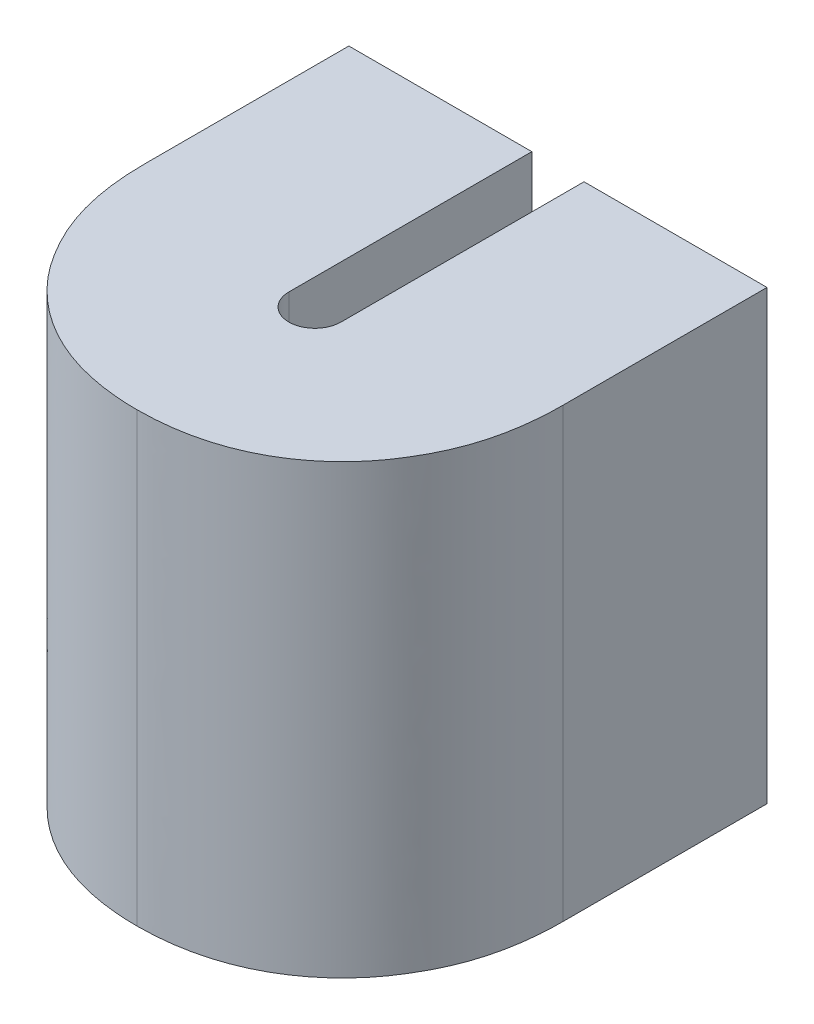
ISO-10303-21;
HEADER;
FILE_DESCRIPTION(('STEP AP214'),'2;1');
FILE_NAME('part.step','',(''),(''),'','','');
FILE_SCHEMA(('AUTOMOTIVE_DESIGN { 1 0 10303 214 1 1 1 1 }'));
ENDSEC;
DATA;
#1=APPLICATION_CONTEXT('core data for automotive mechanical design processes');
#2=APPLICATION_PROTOCOL_DEFINITION('international standard','automotive_design',2000,#1);
#3=PRODUCT_CONTEXT('',#1,'mechanical');
#4=PRODUCT('Part','Part','',(#3));
#5=PRODUCT_RELATED_PRODUCT_CATEGORY('part','',(#4));
#6=PRODUCT_DEFINITION_FORMATION('','',#4);
#7=PRODUCT_DEFINITION_CONTEXT('part definition',#1,'design');
#8=PRODUCT_DEFINITION('design','',#6,#7);
#9=PRODUCT_DEFINITION_SHAPE('','',#8);
#10=(LENGTH_UNIT() NAMED_UNIT(*) SI_UNIT(.MILLI.,.METRE.));
#11=(NAMED_UNIT(*) PLANE_ANGLE_UNIT() SI_UNIT($,.RADIAN.));
#12=(NAMED_UNIT(*) SI_UNIT($,.STERADIAN.) SOLID_ANGLE_UNIT());
#13=UNCERTAINTY_MEASURE_WITH_UNIT(LENGTH_MEASURE(1.E-05),#10,'distance_accuracy_value','');
#14=(GEOMETRIC_REPRESENTATION_CONTEXT(3) GLOBAL_UNCERTAINTY_ASSIGNED_CONTEXT((#13)) GLOBAL_UNIT_ASSIGNED_CONTEXT((#10,
#11,#12)) REPRESENTATION_CONTEXT('',''));
#15=CARTESIAN_POINT('',(0.,0.,0.));
#16=DIRECTION('',(0.,0.,1.));
#17=DIRECTION('',(1.,0.,0.));
#18=AXIS2_PLACEMENT_3D('',#15,#16,#17);
#19=CARTESIAN_POINT('',(-701.33693305751,1500.,-727.733409360212));
#20=CARTESIAN_POINT('',(-701.33693305751,1500.,-516.521967782166));
#21=CARTESIAN_POINT('',(-626.802318267884,1500.,-362.488301594403));
#22=CARTESIAN_POINT('',(-504.735344157562,1500.,-189.729761618299));
#23=CARTESIAN_POINT('',(-300.828052657585,1500.,1.50207767655617E-11));
#24=CARTESIAN_POINT('',(7.20848692998497E-12,1500.,0.));
#25=B_SPLINE_CURVE_WITH_KNOTS('',3,(#19,#20,#21,#22,#23,#24),.UNSPECIFIED.,.F.,.F.,(4,1,1,4),
(0.,0.501134505368616,0.601134505368616,1.),.UNSPECIFIED.);
#26=DIRECTION('',(0.,-1.,0.));
#27=VECTOR('',#26,1.);
#28=SURFACE_OF_LINEAR_EXTRUSION('',#25,#27);
#29=CARTESIAN_POINT('',(-701.33693305751,0.,-727.733409360212));
#30=CARTESIAN_POINT('',(-701.33693305751,0.,-516.521967782166));
#31=CARTESIAN_POINT('',(-626.802318267884,0.,-362.488301594403));
#32=CARTESIAN_POINT('',(-504.735344157562,0.,-189.729761618299));
#33=CARTESIAN_POINT('',(-300.828052657585,0.,1.50207767655617E-11));
#34=CARTESIAN_POINT('',(7.20848692998497E-12,0.,0.));
#35=B_SPLINE_CURVE_WITH_KNOTS('',3,(#29,#30,#31,#32,#33,#34),.UNSPECIFIED.,.F.,.F.,(4,1,1,4),
(0.,0.501134505368616,0.601134505368616,1.),.UNSPECIFIED.);
#36=CARTESIAN_POINT('',(-701.33693305751,0.,-727.733409360212));
#37=VERTEX_POINT('',#36);
#38=CARTESIAN_POINT('',(-7.20848692998497E-12,0.,0.));
#39=VERTEX_POINT('',#38);
#40=EDGE_CURVE('E140',#37,#39,#35,.T.);
#41=ORIENTED_EDGE('',*,*,#40,.T.);
#42=DIRECTION('',(0.,-1.,0.));
#43=VECTOR('',#42,1.);
#44=CARTESIAN_POINT('',(-7.20848692998497E-12,1500.,0.));
#45=LINE('',#44,#43);
#46=CARTESIAN_POINT('',(-7.20848692998497E-12,1500.,0.));
#47=VERTEX_POINT('',#46);
#48=EDGE_CURVE('E11',#47,#39,#45,.T.);
#49=ORIENTED_EDGE('',*,*,#48,.F.);
#50=CARTESIAN_POINT('',(-701.33693305751,1500.,-727.733409360212));
#51=VERTEX_POINT('',#50);
#52=EDGE_CURVE('E166',#51,#47,#25,.T.);
#53=ORIENTED_EDGE('',*,*,#52,.F.);
#54=DIRECTION('',(0.,-1.,0.));
#55=VECTOR('',#54,1.);
#56=CARTESIAN_POINT('',(-701.33693305751,1500.,-727.733409360212));
#57=LINE('',#56,#55);
#58=EDGE_CURVE('E136',#51,#37,#57,.T.);
#59=ORIENTED_EDGE('',*,*,#58,.T.);
#60=EDGE_LOOP('',(#41,#49,#53,#59));
#61=FACE_BOUND('',#60,.T.);
#62=ADVANCED_FACE('F37',(#61),#28,.F.);
#63=CARTESIAN_POINT('',(-7.20848692998497E-12,1500.,0.));
#64=CARTESIAN_POINT('',(300.828052657585,1500.,1.50207767655617E-11));
#65=CARTESIAN_POINT('',(504.735344157562,1500.,-189.729761618299));
#66=CARTESIAN_POINT('',(626.802318267884,1500.,-362.488301594403));
#67=CARTESIAN_POINT('',(701.33693305751,1500.,-516.521967782166));
#68=CARTESIAN_POINT('',(701.33693305751,1500.,-727.733409360212));
#69=B_SPLINE_CURVE_WITH_KNOTS('',3,(#63,#64,#65,#66,#67,#68),.UNSPECIFIED.,.F.,.F.,(4,1,1,4),
(0.,0.398865494631384,0.498865494631384,1.),.UNSPECIFIED.);
#70=DIRECTION('',(0.,-1.,0.));
#71=VECTOR('',#70,1.);
#72=SURFACE_OF_LINEAR_EXTRUSION('',#69,#71);
#73=CARTESIAN_POINT('',(-7.20848692998497E-12,0.,0.));
#74=CARTESIAN_POINT('',(300.828052657585,0.,1.50207767655617E-11));
#75=CARTESIAN_POINT('',(504.735344157562,0.,-189.729761618299));
#76=CARTESIAN_POINT('',(626.802318267884,0.,-362.488301594403));
#77=CARTESIAN_POINT('',(701.33693305751,0.,-516.521967782166));
#78=CARTESIAN_POINT('',(701.33693305751,0.,-727.733409360212));
#79=B_SPLINE_CURVE_WITH_KNOTS('',3,(#73,#74,#75,#76,#77,#78),.UNSPECIFIED.,.F.,.F.,(4,1,1,4),
(0.,0.398865494631384,0.498865494631384,1.),.UNSPECIFIED.);
#80=CARTESIAN_POINT('',(701.33693305751,0.,-727.733409360212));
#81=VERTEX_POINT('',#80);
#82=EDGE_CURVE('E145',#39,#81,#79,.T.);
#83=ORIENTED_EDGE('',*,*,#82,.T.);
#84=DIRECTION('',(0.,-1.,0.));
#85=VECTOR('',#84,1.);
#86=CARTESIAN_POINT('',(701.33693305751,1500.,-727.733409360212));
#87=LINE('',#86,#85);
#88=CARTESIAN_POINT('',(701.33693305751,1500.,-727.733409360212));
#89=VERTEX_POINT('',#88);
#90=EDGE_CURVE('E46',#89,#81,#87,.T.);
#91=ORIENTED_EDGE('',*,*,#90,.F.);
#92=EDGE_CURVE('E100',#47,#89,#69,.T.);
#93=ORIENTED_EDGE('',*,*,#92,.F.);
#94=ORIENTED_EDGE('',*,*,#48,.T.);
#95=EDGE_LOOP('',(#83,#91,#93,#94));
#96=FACE_BOUND('',#95,.T.);
#97=ADVANCED_FACE('F214',(#96),#72,.F.);
#98=CARTESIAN_POINT('',(701.33693305751,1500.,-727.733409360212));
#99=DIRECTION('',(-1.,0.,0.));
#100=DIRECTION('',(0.,0.,1.));
#101=AXIS2_PLACEMENT_3D('',#98,#99,#100);
#102=PLANE('',#101);
#103=DIRECTION('',(0.,0.,-1.));
#104=VECTOR('',#103,1.);
#105=CARTESIAN_POINT('',(701.33693305751,0.,-727.733409360212));
#106=LINE('',#105,#104);
#107=CARTESIAN_POINT('',(701.33693305751,0.,-1412.));
#108=VERTEX_POINT('',#107);
#109=EDGE_CURVE('E152',#81,#108,#106,.T.);
#110=ORIENTED_EDGE('',*,*,#109,.T.);
#111=DIRECTION('',(0.,-1.,0.));
#112=VECTOR('',#111,1.);
#113=CARTESIAN_POINT('',(701.33693305751,1500.,-1412.));
#114=LINE('',#113,#112);
#115=CARTESIAN_POINT('',(701.33693305751,1500.,-1412.));
#116=VERTEX_POINT('',#115);
#117=EDGE_CURVE('E176',#116,#108,#114,.T.);
#118=ORIENTED_EDGE('',*,*,#117,.F.);
#119=DIRECTION('',(0.,0.,-1.));
#120=VECTOR('',#119,1.);
#121=CARTESIAN_POINT('',(701.33693305751,1500.,-727.733409360212));
#122=LINE('',#121,#120);
#123=EDGE_CURVE('E184',#89,#116,#122,.T.);
#124=ORIENTED_EDGE('',*,*,#123,.F.);
#125=ORIENTED_EDGE('',*,*,#90,.T.);
#126=EDGE_LOOP('',(#110,#118,#124,#125));
#127=FACE_BOUND('',#126,.T.);
#128=ADVANCED_FACE('F182',(#127),#102,.F.);
#129=CARTESIAN_POINT('',(701.33693305751,1500.,-1412.));
#130=DIRECTION('',(0.,0.,1.));
#131=DIRECTION('',(1.,0.,0.));
#132=AXIS2_PLACEMENT_3D('',#129,#130,#131);
#133=PLANE('',#132);
#134=DIRECTION('',(-1.,0.,0.));
#135=VECTOR('',#134,1.);
#136=CARTESIAN_POINT('',(701.33693305751,0.,-1412.));
#137=LINE('',#136,#135);
#138=CARTESIAN_POINT('',(87.5000000000003,0.,-1412.));
#139=VERTEX_POINT('',#138);
#140=EDGE_CURVE('E157',#108,#139,#137,.T.);
#141=ORIENTED_EDGE('',*,*,#140,.T.);
#142=DIRECTION('',(0.,-1.,0.));
#143=VECTOR('',#142,1.);
#144=CARTESIAN_POINT('',(87.5000000000003,1500.,-1412.));
#145=LINE('',#144,#143);
#146=CARTESIAN_POINT('',(87.5000000000003,1500.,-1412.));
#147=VERTEX_POINT('',#146);
#148=EDGE_CURVE('E173',#147,#139,#145,.T.);
#149=ORIENTED_EDGE('',*,*,#148,.F.);
#150=DIRECTION('',(-1.,0.,0.));
#151=VECTOR('',#150,1.);
#152=CARTESIAN_POINT('',(701.33693305751,1500.,-1412.));
#153=LINE('',#152,#151);
#154=EDGE_CURVE('E200',#116,#147,#153,.T.);
#155=ORIENTED_EDGE('',*,*,#154,.F.);
#156=ORIENTED_EDGE('',*,*,#117,.T.);
#157=EDGE_LOOP('',(#141,#149,#155,#156));
#158=FACE_BOUND('',#157,.T.);
#159=ADVANCED_FACE('F193',(#158),#133,.F.);
#160=CARTESIAN_POINT('',(87.5000000000003,1500.,-1412.));
#161=DIRECTION('',(1.,0.,0.));
#162=DIRECTION('',(0.,0.,-1.));
#163=AXIS2_PLACEMENT_3D('',#160,#161,#162);
#164=PLANE('',#163);
#165=DIRECTION('',(0.,0.,1.));
#166=VECTOR('',#165,1.);
#167=CARTESIAN_POINT('',(87.5000000000003,0.,-1412.));
#168=LINE('',#167,#166);
#169=CARTESIAN_POINT('',(87.5000000000003,0.,-596.839793383717));
#170=VERTEX_POINT('',#169);
#171=EDGE_CURVE('E159',#139,#170,#168,.T.);
#172=ORIENTED_EDGE('',*,*,#171,.T.);
#173=DIRECTION('',(0.,-1.,0.));
#174=VECTOR('',#173,1.);
#175=CARTESIAN_POINT('',(87.5000000000003,1500.,-596.839793383717));
#176=LINE('',#175,#174);
#177=CARTESIAN_POINT('',(87.5000000000003,1500.,-596.839793383717));
#178=VERTEX_POINT('',#177);
#179=EDGE_CURVE('E170',#178,#170,#176,.T.);
#180=ORIENTED_EDGE('',*,*,#179,.F.);
#181=DIRECTION('',(0.,0.,1.));
#182=VECTOR('',#181,1.);
#183=CARTESIAN_POINT('',(87.5000000000003,1500.,-1412.));
#184=LINE('',#183,#182);
#185=EDGE_CURVE('E199',#147,#178,#184,.T.);
#186=ORIENTED_EDGE('',*,*,#185,.F.);
#187=ORIENTED_EDGE('',*,*,#148,.T.);
#188=EDGE_LOOP('',(#172,#180,#186,#187));
#189=FACE_BOUND('',#188,.T.);
#190=ADVANCED_FACE('F197',(#189),#164,.F.);
#191=CARTESIAN_POINT('',(0.,1500.,-596.839793383717));
#192=DIRECTION('',(0.,-1.,0.));
#193=DIRECTION('',(0.,0.,-1.));
#194=AXIS2_PLACEMENT_3D('',#191,#192,#193);
#195=CYLINDRICAL_SURFACE('',#194,87.5000000000003);
#196=CARTESIAN_POINT('',(0.,0.,-596.839793383717));
#197=DIRECTION('',(0.,-1.,0.));
#198=DIRECTION('',(0.,0.,-1.));
#199=AXIS2_PLACEMENT_3D('',#196,#197,#198);
#200=CIRCLE('',#199,87.5000000000003);
#201=CARTESIAN_POINT('',(-87.5000000000003,0.,-596.839793383717));
#202=VERTEX_POINT('',#201);
#203=EDGE_CURVE('E161',#170,#202,#200,.T.);
#204=ORIENTED_EDGE('',*,*,#203,.T.);
#205=DIRECTION('',(0.,-1.,0.));
#206=VECTOR('',#205,1.);
#207=CARTESIAN_POINT('',(-87.5000000000003,1500.,-596.839793383717));
#208=LINE('',#207,#206);
#209=CARTESIAN_POINT('',(-87.5000000000003,1500.,-596.839793383717));
#210=VERTEX_POINT('',#209);
#211=EDGE_CURVE('E131',#210,#202,#208,.T.);
#212=ORIENTED_EDGE('',*,*,#211,.F.);
#213=CARTESIAN_POINT('',(0.,1500.,-596.839793383717));
#214=DIRECTION('',(0.,-1.,0.));
#215=DIRECTION('',(0.,0.,-1.));
#216=AXIS2_PLACEMENT_3D('',#213,#214,#215);
#217=CIRCLE('',#216,87.5000000000003);
#218=EDGE_CURVE('E122',#178,#210,#217,.T.);
#219=ORIENTED_EDGE('',*,*,#218,.F.);
#220=ORIENTED_EDGE('',*,*,#179,.T.);
#221=EDGE_LOOP('',(#204,#212,#219,#220));
#222=FACE_BOUND('',#221,.T.);
#223=ADVANCED_FACE('F223',(#222),#195,.F.);
#224=CARTESIAN_POINT('',(-87.5000000000003,1500.,-1412.));
#225=DIRECTION('',(-1.,0.,0.));
#226=DIRECTION('',(0.,0.,1.));
#227=AXIS2_PLACEMENT_3D('',#224,#225,#226);
#228=PLANE('',#227);
#229=DIRECTION('',(0.,0.,-1.));
#230=VECTOR('',#229,1.);
#231=CARTESIAN_POINT('',(-87.5000000000003,0.,-1412.));
#232=LINE('',#231,#230);
#233=CARTESIAN_POINT('',(-87.5000000000003,0.,-1412.));
#234=VERTEX_POINT('',#233);
#235=EDGE_CURVE('E130',#202,#234,#232,.T.);
#236=ORIENTED_EDGE('',*,*,#235,.T.);
#237=DIRECTION('',(0.,-1.,0.));
#238=VECTOR('',#237,1.);
#239=CARTESIAN_POINT('',(-87.5000000000003,1500.,-1412.));
#240=LINE('',#239,#238);
#241=CARTESIAN_POINT('',(-87.5000000000003,1500.,-1412.));
#242=VERTEX_POINT('',#241);
#243=EDGE_CURVE('E127',#242,#234,#240,.T.);
#244=ORIENTED_EDGE('',*,*,#243,.F.);
#245=DIRECTION('',(0.,0.,-1.));
#246=VECTOR('',#245,1.);
#247=CARTESIAN_POINT('',(-87.5000000000003,1500.,-1412.));
#248=LINE('',#247,#246);
#249=EDGE_CURVE('E116',#210,#242,#248,.T.);
#250=ORIENTED_EDGE('',*,*,#249,.F.);
#251=ORIENTED_EDGE('',*,*,#211,.T.);
#252=EDGE_LOOP('',(#236,#244,#250,#251));
#253=FACE_BOUND('',#252,.T.);
#254=ADVANCED_FACE('F128',(#253),#228,.F.);
#255=CARTESIAN_POINT('',(-701.33693305751,1500.,-1412.));
#256=DIRECTION('',(0.,0.,1.));
#257=DIRECTION('',(1.,0.,0.));
#258=AXIS2_PLACEMENT_3D('',#255,#256,#257);
#259=PLANE('',#258);
#260=DIRECTION('',(-1.,0.,0.));
#261=VECTOR('',#260,1.);
#262=CARTESIAN_POINT('',(-701.33693305751,0.,-1412.));
#263=LINE('',#262,#261);
#264=CARTESIAN_POINT('',(-701.33693305751,0.,-1412.));
#265=VERTEX_POINT('',#264);
#266=EDGE_CURVE('E86',#234,#265,#263,.T.);
#267=ORIENTED_EDGE('',*,*,#266,.T.);
#268=DIRECTION('',(0.,-1.,0.));
#269=VECTOR('',#268,1.);
#270=CARTESIAN_POINT('',(-701.33693305751,1500.,-1412.));
#271=LINE('',#270,#269);
#272=CARTESIAN_POINT('',(-701.33693305751,1500.,-1412.));
#273=VERTEX_POINT('',#272);
#274=EDGE_CURVE('E132',#273,#265,#271,.T.);
#275=ORIENTED_EDGE('',*,*,#274,.F.);
#276=DIRECTION('',(-1.,0.,0.));
#277=VECTOR('',#276,1.);
#278=CARTESIAN_POINT('',(-701.33693305751,1500.,-1412.));
#279=LINE('',#278,#277);
#280=EDGE_CURVE('E120',#242,#273,#279,.T.);
#281=ORIENTED_EDGE('',*,*,#280,.F.);
#282=ORIENTED_EDGE('',*,*,#243,.T.);
#283=EDGE_LOOP('',(#267,#275,#281,#282));
#284=FACE_BOUND('',#283,.T.);
#285=ADVANCED_FACE('F134',(#284),#259,.F.);
#286=CARTESIAN_POINT('',(-701.33693305751,1500.,-727.733409360212));
#287=DIRECTION('',(1.,0.,0.));
#288=DIRECTION('',(0.,0.,-1.));
#289=AXIS2_PLACEMENT_3D('',#286,#287,#288);
#290=PLANE('',#289);
#291=DIRECTION('',(0.,0.,1.));
#292=VECTOR('',#291,1.);
#293=CARTESIAN_POINT('',(-701.33693305751,0.,-727.733409360212));
#294=LINE('',#293,#292);
#295=EDGE_CURVE('E92',#265,#37,#294,.T.);
#296=ORIENTED_EDGE('',*,*,#295,.T.);
#297=ORIENTED_EDGE('',*,*,#58,.F.);
#298=DIRECTION('',(0.,0.,1.));
#299=VECTOR('',#298,1.);
#300=CARTESIAN_POINT('',(-701.33693305751,1500.,-727.733409360212));
#301=LINE('',#300,#299);
#302=EDGE_CURVE('E54',#273,#51,#301,.T.);
#303=ORIENTED_EDGE('',*,*,#302,.F.);
#304=ORIENTED_EDGE('',*,*,#274,.T.);
#305=EDGE_LOOP('',(#296,#297,#303,#304));
#306=FACE_BOUND('',#305,.T.);
#307=ADVANCED_FACE('F231',(#306),#290,.F.);
#308=CARTESIAN_POINT('',(-578.285588743423,1500.,-295.213381123404));
#309=DIRECTION('',(0.,-1.,0.));
#310=DIRECTION('',(0.,0.,-1.));
#311=AXIS2_PLACEMENT_3D('',#308,#309,#310);
#312=PLANE('',#311);
#313=ORIENTED_EDGE('',*,*,#52,.T.);
#314=ORIENTED_EDGE('',*,*,#92,.T.);
#315=ORIENTED_EDGE('',*,*,#123,.T.);
#316=ORIENTED_EDGE('',*,*,#154,.T.);
#317=ORIENTED_EDGE('',*,*,#185,.T.);
#318=ORIENTED_EDGE('',*,*,#218,.T.);
#319=ORIENTED_EDGE('',*,*,#249,.T.);
#320=ORIENTED_EDGE('',*,*,#280,.T.);
#321=ORIENTED_EDGE('',*,*,#302,.T.);
#322=EDGE_LOOP('',(#313,#314,#315,#316,#317,#318,#319,#320,#321));
#323=FACE_BOUND('',#322,.T.);
#324=ADVANCED_FACE('F118',(#323),#312,.F.);
#325=CARTESIAN_POINT('',(-578.285588743423,0.,-295.213381123404));
#326=DIRECTION('',(0.,-1.,0.));
#327=DIRECTION('',(0.,0.,-1.));
#328=AXIS2_PLACEMENT_3D('',#325,#326,#327);
#329=PLANE('',#328);
#330=ORIENTED_EDGE('',*,*,#40,.F.);
#331=ORIENTED_EDGE('',*,*,#295,.F.);
#332=ORIENTED_EDGE('',*,*,#266,.F.);
#333=ORIENTED_EDGE('',*,*,#235,.F.);
#334=ORIENTED_EDGE('',*,*,#203,.F.);
#335=ORIENTED_EDGE('',*,*,#171,.F.);
#336=ORIENTED_EDGE('',*,*,#140,.F.);
#337=ORIENTED_EDGE('',*,*,#109,.F.);
#338=ORIENTED_EDGE('',*,*,#82,.F.);
#339=EDGE_LOOP('',(#330,#331,#332,#333,#334,#335,#336,#337,#338));
#340=FACE_BOUND('',#339,.T.);
#341=ADVANCED_FACE('F188',(#340),#329,.T.);
#342=CLOSED_SHELL('',(#62,#97,#128,#159,#190,#223,#254,#285,#307,#324,#341));
#343=MANIFOLD_SOLID_BREP('B2',#342);
#344=ADVANCED_BREP_SHAPE_REPRESENTATION('',(#18,#343),#14);
#345=SHAPE_DEFINITION_REPRESENTATION(#9,#344);
ENDSEC;
END-ISO-10303-21;
